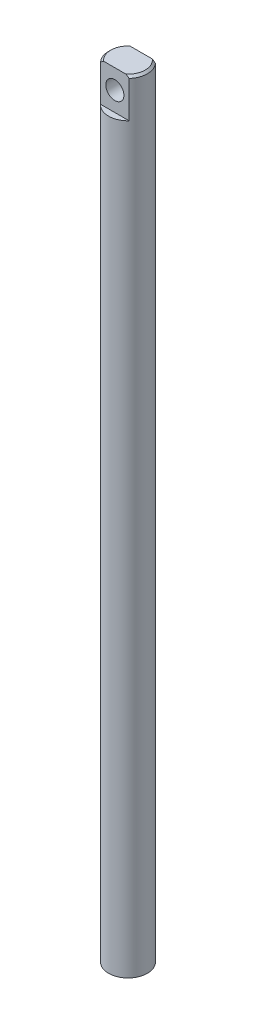
ISO-10303-21;
HEADER;
FILE_DESCRIPTION(('STEP AP214'),'2;1');
FILE_NAME('part.step','',(''),(''),'','','');
FILE_SCHEMA(('AUTOMOTIVE_DESIGN { 1 0 10303 214 1 1 1 1 }'));
ENDSEC;
DATA;
#1=APPLICATION_CONTEXT('core data for automotive mechanical design processes');
#2=APPLICATION_PROTOCOL_DEFINITION('international standard','automotive_design',2000,#1);
#3=PRODUCT_CONTEXT('',#1,'mechanical');
#4=PRODUCT('Part','Part','',(#3));
#5=PRODUCT_RELATED_PRODUCT_CATEGORY('part','',(#4));
#6=PRODUCT_DEFINITION_FORMATION('','',#4);
#7=PRODUCT_DEFINITION_CONTEXT('part definition',#1,'design');
#8=PRODUCT_DEFINITION('design','',#6,#7);
#9=PRODUCT_DEFINITION_SHAPE('','',#8);
#10=(LENGTH_UNIT() NAMED_UNIT(*) SI_UNIT(.MILLI.,.METRE.));
#11=(NAMED_UNIT(*) PLANE_ANGLE_UNIT() SI_UNIT($,.RADIAN.));
#12=(NAMED_UNIT(*) SI_UNIT($,.STERADIAN.) SOLID_ANGLE_UNIT());
#13=UNCERTAINTY_MEASURE_WITH_UNIT(LENGTH_MEASURE(1.E-05),#10,'distance_accuracy_value','');
#14=(GEOMETRIC_REPRESENTATION_CONTEXT(3) GLOBAL_UNCERTAINTY_ASSIGNED_CONTEXT((#13)) GLOBAL_UNIT_ASSIGNED_CONTEXT((#10,
#11,#12)) REPRESENTATION_CONTEXT('',''));
#15=CARTESIAN_POINT('',(0.,0.,0.));
#16=DIRECTION('',(0.,0.,1.));
#17=DIRECTION('',(1.,0.,0.));
#18=AXIS2_PLACEMENT_3D('',#15,#16,#17);
#19=CARTESIAN_POINT('',(0.,-4.5,-4.5));
#20=DIRECTION('',(0.,0.,1.));
#21=DIRECTION('',(1.,0.,0.));
#22=AXIS2_PLACEMENT_3D('',#19,#20,#21);
#23=CYLINDRICAL_SURFACE('',#22,2.1);
#24=CARTESIAN_POINT('',(0.,-4.5,-3.05));
#25=DIRECTION('',(0.,0.,-1.));
#26=DIRECTION('',(-1.,0.,0.));
#27=AXIS2_PLACEMENT_3D('',#24,#25,#26);
#28=CIRCLE('',#27,2.1);
#29=CARTESIAN_POINT('',(-2.1,-4.5,-3.05));
#30=VERTEX_POINT('',#29);
#31=EDGE_CURVE('E11',#30,#30,#28,.T.);
#32=ORIENTED_EDGE('',*,*,#31,.T.);
#33=EDGE_LOOP('',(#32));
#34=FACE_BOUND('',#33,.T.);
#35=CARTESIAN_POINT('',(0.,-4.5,3.05));
#36=DIRECTION('',(0.,0.,1.));
#37=DIRECTION('',(1.,0.,0.));
#38=AXIS2_PLACEMENT_3D('',#35,#36,#37);
#39=CIRCLE('',#38,2.1);
#40=CARTESIAN_POINT('',(2.1,-4.5,3.05));
#41=VERTEX_POINT('',#40);
#42=EDGE_CURVE('E44',#41,#41,#39,.T.);
#43=ORIENTED_EDGE('',*,*,#42,.T.);
#44=EDGE_LOOP('',(#43));
#45=FACE_BOUND('',#44,.T.);
#46=ADVANCED_FACE('F17',(#34,#45),#23,.F.);
#47=CARTESIAN_POINT('',(0.,0.,0.));
#48=DIRECTION('',(0.,-1.,0.));
#49=DIRECTION('',(0.,0.,-1.));
#50=AXIS2_PLACEMENT_3D('',#47,#48,#49);
#51=CONICAL_SURFACE('',#50,4.,0.785398163397443);
#52=CARTESIAN_POINT('',(3.30870065131314,-0.499999999999999,3.05));
#53=CARTESIAN_POINT('',(2.92712829063525,-0.219442507044849,3.05));
#54=CARTESIAN_POINT('',(2.58795285892156,0.,3.05));
#55=B_SPLINE_CURVE_WITH_KNOTS('',2,(#52,#53,#54),.UNSPECIFIED.,.F.,.F.,(3,3),(0.,1.),.UNSPECIFIED.);
#56=CARTESIAN_POINT('',(3.30870065131314,-0.499999999999973,3.05));
#57=VERTEX_POINT('',#56);
#58=CARTESIAN_POINT('',(2.58795285892156,0.,3.05));
#59=VERTEX_POINT('',#58);
#60=EDGE_CURVE('E191',#57,#59,#55,.T.);
#61=ORIENTED_EDGE('',*,*,#60,.F.);
#62=CARTESIAN_POINT('',(0.,-0.499999999999973,0.));
#63=DIRECTION('',(0.,-1.,0.));
#64=DIRECTION('',(0.,0.,1.));
#65=AXIS2_PLACEMENT_3D('',#62,#63,#64);
#66=CIRCLE('',#65,4.5);
#67=CARTESIAN_POINT('',(3.30870065131314,-0.499999999999973,-3.05));
#68=VERTEX_POINT('',#67);
#69=EDGE_CURVE('E107',#68,#57,#66,.T.);
#70=ORIENTED_EDGE('',*,*,#69,.F.);
#71=CARTESIAN_POINT('',(2.58795285892156,0.,-3.05));
#72=CARTESIAN_POINT('',(2.92712829063524,-0.219442507044849,-3.05));
#73=CARTESIAN_POINT('',(3.30870065131314,-0.499999999999999,-3.05));
#74=B_SPLINE_CURVE_WITH_KNOTS('',2,(#71,#72,#73),.UNSPECIFIED.,.F.,.F.,(3,3),(0.,1.),.UNSPECIFIED.);
#75=CARTESIAN_POINT('',(2.58795285892156,0.,-3.05));
#76=VERTEX_POINT('',#75);
#77=EDGE_CURVE('E26',#76,#68,#74,.T.);
#78=ORIENTED_EDGE('',*,*,#77,.F.);
#79=CARTESIAN_POINT('',(0.,0.,0.));
#80=DIRECTION('',(0.,1.,0.));
#81=DIRECTION('',(0.,0.,1.));
#82=AXIS2_PLACEMENT_3D('',#79,#80,#81);
#83=CIRCLE('',#82,4.);
#84=EDGE_CURVE('E104',#59,#76,#83,.T.);
#85=ORIENTED_EDGE('',*,*,#84,.F.);
#86=EDGE_LOOP('',(#61,#70,#78,#85));
#87=FACE_BOUND('',#86,.T.);
#88=ADVANCED_FACE('F103',(#87),#51,.T.);
#89=CARTESIAN_POINT('',(0.,0.,0.));
#90=DIRECTION('',(0.,-1.,0.));
#91=DIRECTION('',(0.,0.,-1.));
#92=AXIS2_PLACEMENT_3D('',#89,#90,#91);
#93=CONICAL_SURFACE('',#92,4.,0.785398163397443);
#94=CARTESIAN_POINT('',(-3.30870065131314,-0.499999999999999,-3.05));
#95=CARTESIAN_POINT('',(-2.92712829063524,-0.219442507044839,-3.05));
#96=CARTESIAN_POINT('',(-2.58795285892156,0.,-3.05));
#97=B_SPLINE_CURVE_WITH_KNOTS('',2,(#94,#95,#96),.UNSPECIFIED.,.F.,.F.,(3,3),(0.,1.),.UNSPECIFIED.);
#98=CARTESIAN_POINT('',(-3.30870065131314,-0.499999999999973,-3.05));
#99=VERTEX_POINT('',#98);
#100=CARTESIAN_POINT('',(-2.58795285892156,0.,-3.05));
#101=VERTEX_POINT('',#100);
#102=EDGE_CURVE('E114',#99,#101,#97,.T.);
#103=ORIENTED_EDGE('',*,*,#102,.F.);
#104=CARTESIAN_POINT('',(0.,-0.499999999999973,0.));
#105=DIRECTION('',(0.,-1.,0.));
#106=DIRECTION('',(0.,0.,1.));
#107=AXIS2_PLACEMENT_3D('',#104,#105,#106);
#108=CIRCLE('',#107,4.5);
#109=CARTESIAN_POINT('',(-3.30870065131314,-0.499999999999973,3.05));
#110=VERTEX_POINT('',#109);
#111=EDGE_CURVE('E207',#110,#99,#108,.T.);
#112=ORIENTED_EDGE('',*,*,#111,.F.);
#113=CARTESIAN_POINT('',(-2.58795285892155,0.,3.05));
#114=CARTESIAN_POINT('',(-2.92712829063522,-0.219442507044839,3.05));
#115=CARTESIAN_POINT('',(-3.30870065131314,-0.499999999999999,3.05));
#116=B_SPLINE_CURVE_WITH_KNOTS('',2,(#113,#114,#115),.UNSPECIFIED.,.F.,.F.,(3,3),(0.,1.),.UNSPECIFIED.);
#117=CARTESIAN_POINT('',(-2.58795285892156,0.,3.05));
#118=VERTEX_POINT('',#117);
#119=EDGE_CURVE('E125',#118,#110,#116,.T.);
#120=ORIENTED_EDGE('',*,*,#119,.F.);
#121=CARTESIAN_POINT('',(0.,0.,0.));
#122=DIRECTION('',(0.,1.,0.));
#123=DIRECTION('',(0.,0.,1.));
#124=AXIS2_PLACEMENT_3D('',#121,#122,#123);
#125=CIRCLE('',#124,4.);
#126=EDGE_CURVE('E132',#101,#118,#125,.T.);
#127=ORIENTED_EDGE('',*,*,#126,.F.);
#128=EDGE_LOOP('',(#103,#112,#120,#127));
#129=FACE_BOUND('',#128,.T.);
#130=ADVANCED_FACE('F173',(#129),#93,.T.);
#131=CARTESIAN_POINT('',(5.,-9.,-3.05));
#132=DIRECTION('',(0.,0.,-1.));
#133=DIRECTION('',(-1.,0.,0.));
#134=AXIS2_PLACEMENT_3D('',#131,#132,#133);
#135=PLANE('',#134);
#136=ORIENTED_EDGE('',*,*,#31,.F.);
#137=EDGE_LOOP('',(#136));
#138=FACE_BOUND('',#137,.T.);
#139=DIRECTION('',(0.,-1.,0.));
#140=VECTOR('',#139,1.);
#141=CARTESIAN_POINT('',(-3.30870065131314,-181.,-3.05));
#142=LINE('',#141,#140);
#143=CARTESIAN_POINT('',(-3.30870065131314,-9.,-3.05));
#144=VERTEX_POINT('',#143);
#145=EDGE_CURVE('E200',#99,#144,#142,.T.);
#146=ORIENTED_EDGE('',*,*,#145,.F.);
#147=ORIENTED_EDGE('',*,*,#102,.T.);
#148=DIRECTION('',(-1.,0.,0.));
#149=VECTOR('',#148,1.);
#150=CARTESIAN_POINT('',(0.,0.,-3.05));
#151=LINE('',#150,#149);
#152=EDGE_CURVE('E121',#76,#101,#151,.T.);
#153=ORIENTED_EDGE('',*,*,#152,.F.);
#154=ORIENTED_EDGE('',*,*,#77,.T.);
#155=DIRECTION('',(0.,1.,0.));
#156=VECTOR('',#155,1.);
#157=CARTESIAN_POINT('',(3.30870065131314,-181.,-3.05));
#158=LINE('',#157,#156);
#159=CARTESIAN_POINT('',(3.30870065131314,-9.,-3.05));
#160=VERTEX_POINT('',#159);
#161=EDGE_CURVE('E151',#160,#68,#158,.T.);
#162=ORIENTED_EDGE('',*,*,#161,.F.);
#163=DIRECTION('',(-1.,0.,0.));
#164=VECTOR('',#163,1.);
#165=CARTESIAN_POINT('',(5.,-9.,-3.05));
#166=LINE('',#165,#164);
#167=EDGE_CURVE('E186',#160,#144,#166,.T.);
#168=ORIENTED_EDGE('',*,*,#167,.T.);
#169=EDGE_LOOP('',(#146,#147,#153,#154,#162,#168));
#170=FACE_BOUND('',#169,.T.);
#171=ADVANCED_FACE('F128',(#138,#170),#135,.T.);
#172=CARTESIAN_POINT('',(0.,-9.,0.));
#173=DIRECTION('',(0.,1.,0.));
#174=DIRECTION('',(1.,0.,0.));
#175=AXIS2_PLACEMENT_3D('',#172,#173,#174);
#176=PLANE('',#175);
#177=ORIENTED_EDGE('',*,*,#167,.F.);
#178=CARTESIAN_POINT('',(0.,-9.,0.));
#179=DIRECTION('',(0.,-1.,0.));
#180=DIRECTION('',(0.,0.,1.));
#181=AXIS2_PLACEMENT_3D('',#178,#179,#180);
#182=CIRCLE('',#181,4.5);
#183=EDGE_CURVE('E156',#144,#160,#182,.T.);
#184=ORIENTED_EDGE('',*,*,#183,.F.);
#185=EDGE_LOOP('',(#177,#184));
#186=FACE_BOUND('',#185,.T.);
#187=ADVANCED_FACE('F172',(#186),#176,.T.);
#188=CARTESIAN_POINT('',(0.,-9.,0.));
#189=DIRECTION('',(0.,1.,0.));
#190=DIRECTION('',(1.,0.,0.));
#191=AXIS2_PLACEMENT_3D('',#188,#189,#190);
#192=PLANE('',#191);
#193=DIRECTION('',(1.,0.,0.));
#194=VECTOR('',#193,1.);
#195=CARTESIAN_POINT('',(5.,-9.,3.05));
#196=LINE('',#195,#194);
#197=CARTESIAN_POINT('',(-3.30870065131314,-9.,3.05));
#198=VERTEX_POINT('',#197);
#199=CARTESIAN_POINT('',(3.30870065131314,-9.,3.05));
#200=VERTEX_POINT('',#199);
#201=EDGE_CURVE('E192',#198,#200,#196,.T.);
#202=ORIENTED_EDGE('',*,*,#201,.F.);
#203=CARTESIAN_POINT('',(0.,-9.,0.));
#204=DIRECTION('',(0.,-1.,0.));
#205=DIRECTION('',(0.,0.,1.));
#206=AXIS2_PLACEMENT_3D('',#203,#204,#205);
#207=CIRCLE('',#206,4.5);
#208=EDGE_CURVE('E141',#200,#198,#207,.T.);
#209=ORIENTED_EDGE('',*,*,#208,.F.);
#210=EDGE_LOOP('',(#202,#209));
#211=FACE_BOUND('',#210,.T.);
#212=ADVANCED_FACE('F242',(#211),#192,.T.);
#213=CARTESIAN_POINT('',(5.,-9.,3.05));
#214=DIRECTION('',(0.,0.,1.));
#215=DIRECTION('',(1.,0.,0.));
#216=AXIS2_PLACEMENT_3D('',#213,#214,#215);
#217=PLANE('',#216);
#218=ORIENTED_EDGE('',*,*,#42,.F.);
#219=EDGE_LOOP('',(#218));
#220=FACE_BOUND('',#219,.T.);
#221=DIRECTION('',(1.,0.,0.));
#222=VECTOR('',#221,1.);
#223=CARTESIAN_POINT('',(0.,0.,3.05));
#224=LINE('',#223,#222);
#225=EDGE_CURVE('E123',#118,#59,#224,.T.);
#226=ORIENTED_EDGE('',*,*,#225,.F.);
#227=ORIENTED_EDGE('',*,*,#119,.T.);
#228=DIRECTION('',(0.,1.,0.));
#229=VECTOR('',#228,1.);
#230=CARTESIAN_POINT('',(-3.30870065131314,-181.,3.05));
#231=LINE('',#230,#229);
#232=EDGE_CURVE('E213',#198,#110,#231,.T.);
#233=ORIENTED_EDGE('',*,*,#232,.F.);
#234=ORIENTED_EDGE('',*,*,#201,.T.);
#235=DIRECTION('',(0.,-1.,0.));
#236=VECTOR('',#235,1.);
#237=CARTESIAN_POINT('',(3.30870065131314,-181.,3.05));
#238=LINE('',#237,#236);
#239=EDGE_CURVE('E150',#57,#200,#238,.T.);
#240=ORIENTED_EDGE('',*,*,#239,.F.);
#241=ORIENTED_EDGE('',*,*,#60,.T.);
#242=EDGE_LOOP('',(#226,#227,#233,#234,#240,#241));
#243=FACE_BOUND('',#242,.T.);
#244=ADVANCED_FACE('F232',(#220,#243),#217,.T.);
#245=CARTESIAN_POINT('',(0.,-181.,0.));
#246=DIRECTION('',(0.,1.,0.));
#247=DIRECTION('',(1.,0.,0.));
#248=AXIS2_PLACEMENT_3D('',#245,#246,#247);
#249=PLANE('',#248);
#250=CARTESIAN_POINT('',(0.,-181.,0.));
#251=DIRECTION('',(0.,1.,0.));
#252=DIRECTION('',(0.,0.,1.));
#253=AXIS2_PLACEMENT_3D('',#250,#251,#252);
#254=CIRCLE('',#253,4.5);
#255=CARTESIAN_POINT('',(0.,-181.,4.5));
#256=VERTEX_POINT('',#255);
#257=EDGE_CURVE('E133',#256,#256,#254,.T.);
#258=ORIENTED_EDGE('',*,*,#257,.F.);
#259=EDGE_LOOP('',(#258));
#260=FACE_BOUND('',#259,.T.);
#261=ADVANCED_FACE('F241',(#260),#249,.F.);
#262=CARTESIAN_POINT('',(0.,0.,0.));
#263=DIRECTION('',(0.,1.,0.));
#264=DIRECTION('',(1.,0.,0.));
#265=AXIS2_PLACEMENT_3D('',#262,#263,#264);
#266=PLANE('',#265);
#267=ORIENTED_EDGE('',*,*,#152,.T.);
#268=ORIENTED_EDGE('',*,*,#126,.T.);
#269=ORIENTED_EDGE('',*,*,#225,.T.);
#270=ORIENTED_EDGE('',*,*,#84,.T.);
#271=EDGE_LOOP('',(#267,#268,#269,#270));
#272=FACE_BOUND('',#271,.T.);
#273=ADVANCED_FACE('F119',(#272),#266,.T.);
#274=CARTESIAN_POINT('',(0.,-181.,0.));
#275=DIRECTION('',(0.,1.,0.));
#276=DIRECTION('',(0.,0.,1.));
#277=AXIS2_PLACEMENT_3D('',#274,#275,#276);
#278=CYLINDRICAL_SURFACE('',#277,4.5);
#279=ORIENTED_EDGE('',*,*,#257,.T.);
#280=EDGE_LOOP('',(#279));
#281=FACE_BOUND('',#280,.T.);
#282=ORIENTED_EDGE('',*,*,#232,.T.);
#283=ORIENTED_EDGE('',*,*,#111,.T.);
#284=ORIENTED_EDGE('',*,*,#145,.T.);
#285=ORIENTED_EDGE('',*,*,#183,.T.);
#286=ORIENTED_EDGE('',*,*,#161,.T.);
#287=ORIENTED_EDGE('',*,*,#69,.T.);
#288=ORIENTED_EDGE('',*,*,#239,.T.);
#289=ORIENTED_EDGE('',*,*,#208,.T.);
#290=EDGE_LOOP('',(#282,#283,#284,#285,#286,#287,#288,#289));
#291=FACE_BOUND('',#290,.T.);
#292=ADVANCED_FACE('F244',(#281,#291),#278,.T.);
#293=CLOSED_SHELL('',(#46,#88,#130,#171,#187,#212,#244,#261,#273,#292));
#294=MANIFOLD_SOLID_BREP('B1',#293);
#295=ADVANCED_BREP_SHAPE_REPRESENTATION('',(#18,#294),#14);
#296=SHAPE_DEFINITION_REPRESENTATION(#9,#295);
ENDSEC;
END-ISO-10303-21;
